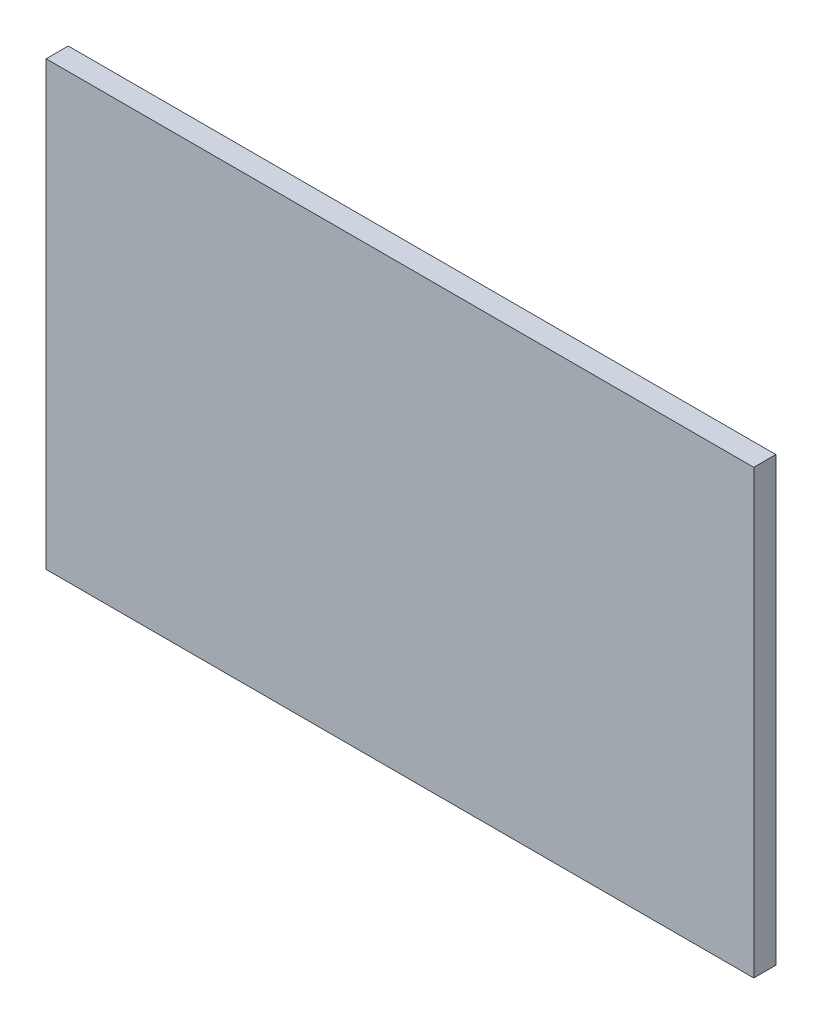
ISO-10303-21;
HEADER;
FILE_DESCRIPTION(('STEP AP214'),'2;1');
FILE_NAME('part.step','',(''),(''),'','','');
FILE_SCHEMA(('AUTOMOTIVE_DESIGN { 1 0 10303 214 1 1 1 1 }'));
ENDSEC;
DATA;
#1=APPLICATION_CONTEXT('core data for automotive mechanical design processes');
#2=APPLICATION_PROTOCOL_DEFINITION('international standard','automotive_design',2000,#1);
#3=PRODUCT_CONTEXT('',#1,'mechanical');
#4=PRODUCT('Part','Part','',(#3));
#5=PRODUCT_RELATED_PRODUCT_CATEGORY('part','',(#4));
#6=PRODUCT_DEFINITION_FORMATION('','',#4);
#7=PRODUCT_DEFINITION_CONTEXT('part definition',#1,'design');
#8=PRODUCT_DEFINITION('design','',#6,#7);
#9=PRODUCT_DEFINITION_SHAPE('','',#8);
#10=(LENGTH_UNIT() NAMED_UNIT(*) SI_UNIT(.MILLI.,.METRE.));
#11=(NAMED_UNIT(*) PLANE_ANGLE_UNIT() SI_UNIT($,.RADIAN.));
#12=(NAMED_UNIT(*) SI_UNIT($,.STERADIAN.) SOLID_ANGLE_UNIT());
#13=UNCERTAINTY_MEASURE_WITH_UNIT(LENGTH_MEASURE(1.E-05),#10,'distance_accuracy_value','');
#14=(GEOMETRIC_REPRESENTATION_CONTEXT(3) GLOBAL_UNCERTAINTY_ASSIGNED_CONTEXT((#13)) GLOBAL_UNIT_ASSIGNED_CONTEXT((#10,
#11,#12)) REPRESENTATION_CONTEXT('',''));
#15=CARTESIAN_POINT('',(0.,0.,0.));
#16=DIRECTION('',(0.,0.,1.));
#17=DIRECTION('',(1.,0.,0.));
#18=AXIS2_PLACEMENT_3D('',#15,#16,#17);
#19=CARTESIAN_POINT('',(400.,250.,25.));
#20=DIRECTION('',(-1.,0.,0.));
#21=DIRECTION('',(0.,-1.,0.));
#22=AXIS2_PLACEMENT_3D('',#19,#20,#21);
#23=PLANE('',#22);
#24=DIRECTION('',(0.,1.,0.));
#25=VECTOR('',#24,1.);
#26=CARTESIAN_POINT('',(400.,250.,0.));
#27=LINE('',#26,#25);
#28=CARTESIAN_POINT('',(400.,-250.,0.));
#29=VERTEX_POINT('',#28);
#30=CARTESIAN_POINT('',(400.,250.,0.));
#31=VERTEX_POINT('',#30);
#32=EDGE_CURVE('E98',#29,#31,#27,.T.);
#33=ORIENTED_EDGE('',*,*,#32,.T.);
#34=DIRECTION('',(0.,0.,-1.));
#35=VECTOR('',#34,1.);
#36=CARTESIAN_POINT('',(400.,250.,25.));
#37=LINE('',#36,#35);
#38=CARTESIAN_POINT('',(400.,250.,25.));
#39=VERTEX_POINT('',#38);
#40=EDGE_CURVE('E11',#39,#31,#37,.T.);
#41=ORIENTED_EDGE('',*,*,#40,.F.);
#42=DIRECTION('',(0.,1.,0.));
#43=VECTOR('',#42,1.);
#44=CARTESIAN_POINT('',(400.,250.,25.));
#45=LINE('',#44,#43);
#46=CARTESIAN_POINT('',(400.,-250.,25.));
#47=VERTEX_POINT('',#46);
#48=EDGE_CURVE('E86',#47,#39,#45,.T.);
#49=ORIENTED_EDGE('',*,*,#48,.F.);
#50=DIRECTION('',(0.,0.,-1.));
#51=VECTOR('',#50,1.);
#52=CARTESIAN_POINT('',(400.,-250.,25.));
#53=LINE('',#52,#51);
#54=EDGE_CURVE('E94',#47,#29,#53,.T.);
#55=ORIENTED_EDGE('',*,*,#54,.T.);
#56=EDGE_LOOP('',(#33,#41,#49,#55));
#57=FACE_BOUND('',#56,.T.);
#58=ADVANCED_FACE('F35',(#57),#23,.F.);
#59=CARTESIAN_POINT('',(-400.,250.,25.));
#60=DIRECTION('',(0.,-1.,0.));
#61=DIRECTION('',(0.,0.,-1.));
#62=AXIS2_PLACEMENT_3D('',#59,#60,#61);
#63=PLANE('',#62);
#64=DIRECTION('',(-1.,0.,0.));
#65=VECTOR('',#64,1.);
#66=CARTESIAN_POINT('',(-400.,250.,0.));
#67=LINE('',#66,#65);
#68=CARTESIAN_POINT('',(-400.,250.,0.));
#69=VERTEX_POINT('',#68);
#70=EDGE_CURVE('E90',#31,#69,#67,.T.);
#71=ORIENTED_EDGE('',*,*,#70,.T.);
#72=DIRECTION('',(0.,0.,-1.));
#73=VECTOR('',#72,1.);
#74=CARTESIAN_POINT('',(-400.,250.,25.));
#75=LINE('',#74,#73);
#76=CARTESIAN_POINT('',(-400.,250.,25.));
#77=VERTEX_POINT('',#76);
#78=EDGE_CURVE('E43',#77,#69,#75,.T.);
#79=ORIENTED_EDGE('',*,*,#78,.F.);
#80=DIRECTION('',(-1.,0.,0.));
#81=VECTOR('',#80,1.);
#82=CARTESIAN_POINT('',(-400.,250.,25.));
#83=LINE('',#82,#81);
#84=EDGE_CURVE('E81',#39,#77,#83,.T.);
#85=ORIENTED_EDGE('',*,*,#84,.F.);
#86=ORIENTED_EDGE('',*,*,#40,.T.);
#87=EDGE_LOOP('',(#71,#79,#85,#86));
#88=FACE_BOUND('',#87,.T.);
#89=ADVANCED_FACE('F89',(#88),#63,.F.);
#90=CARTESIAN_POINT('',(-400.,250.,25.));
#91=DIRECTION('',(1.,0.,0.));
#92=DIRECTION('',(0.,1.,0.));
#93=AXIS2_PLACEMENT_3D('',#90,#91,#92);
#94=PLANE('',#93);
#95=DIRECTION('',(0.,-1.,0.));
#96=VECTOR('',#95,1.);
#97=CARTESIAN_POINT('',(-400.,250.,0.));
#98=LINE('',#97,#96);
#99=CARTESIAN_POINT('',(-400.,-250.,0.));
#100=VERTEX_POINT('',#99);
#101=EDGE_CURVE('E68',#69,#100,#98,.T.);
#102=ORIENTED_EDGE('',*,*,#101,.T.);
#103=DIRECTION('',(0.,0.,-1.));
#104=VECTOR('',#103,1.);
#105=CARTESIAN_POINT('',(-400.,-250.,25.));
#106=LINE('',#105,#104);
#107=CARTESIAN_POINT('',(-400.,-250.,25.));
#108=VERTEX_POINT('',#107);
#109=EDGE_CURVE('E91',#108,#100,#106,.T.);
#110=ORIENTED_EDGE('',*,*,#109,.F.);
#111=DIRECTION('',(0.,-1.,0.));
#112=VECTOR('',#111,1.);
#113=CARTESIAN_POINT('',(-400.,250.,25.));
#114=LINE('',#113,#112);
#115=EDGE_CURVE('E84',#77,#108,#114,.T.);
#116=ORIENTED_EDGE('',*,*,#115,.F.);
#117=ORIENTED_EDGE('',*,*,#78,.T.);
#118=EDGE_LOOP('',(#102,#110,#116,#117));
#119=FACE_BOUND('',#118,.T.);
#120=ADVANCED_FACE('F92',(#119),#94,.F.);
#121=CARTESIAN_POINT('',(-400.,-250.,25.));
#122=DIRECTION('',(0.,1.,0.));
#123=DIRECTION('',(0.,0.,1.));
#124=AXIS2_PLACEMENT_3D('',#121,#122,#123);
#125=PLANE('',#124);
#126=DIRECTION('',(1.,0.,0.));
#127=VECTOR('',#126,1.);
#128=CARTESIAN_POINT('',(-400.,-250.,0.));
#129=LINE('',#128,#127);
#130=EDGE_CURVE('E74',#100,#29,#129,.T.);
#131=ORIENTED_EDGE('',*,*,#130,.T.);
#132=ORIENTED_EDGE('',*,*,#54,.F.);
#133=DIRECTION('',(1.,0.,0.));
#134=VECTOR('',#133,1.);
#135=CARTESIAN_POINT('',(-400.,-250.,25.));
#136=LINE('',#135,#134);
#137=EDGE_CURVE('E51',#108,#47,#136,.T.);
#138=ORIENTED_EDGE('',*,*,#137,.F.);
#139=ORIENTED_EDGE('',*,*,#109,.T.);
#140=EDGE_LOOP('',(#131,#132,#138,#139));
#141=FACE_BOUND('',#140,.T.);
#142=ADVANCED_FACE('F105',(#141),#125,.F.);
#143=CARTESIAN_POINT('',(0.,0.,25.));
#144=DIRECTION('',(0.,0.,1.));
#145=DIRECTION('',(1.,0.,0.));
#146=AXIS2_PLACEMENT_3D('',#143,#144,#145);
#147=PLANE('',#146);
#148=ORIENTED_EDGE('',*,*,#48,.T.);
#149=ORIENTED_EDGE('',*,*,#84,.T.);
#150=ORIENTED_EDGE('',*,*,#115,.T.);
#151=ORIENTED_EDGE('',*,*,#137,.T.);
#152=EDGE_LOOP('',(#148,#149,#150,#151));
#153=FACE_BOUND('',#152,.T.);
#154=ADVANCED_FACE('F82',(#153),#147,.T.);
#155=CARTESIAN_POINT('',(0.,0.,0.));
#156=DIRECTION('',(0.,0.,1.));
#157=DIRECTION('',(1.,0.,0.));
#158=AXIS2_PLACEMENT_3D('',#155,#156,#157);
#159=PLANE('',#158);
#160=ORIENTED_EDGE('',*,*,#32,.F.);
#161=ORIENTED_EDGE('',*,*,#130,.F.);
#162=ORIENTED_EDGE('',*,*,#101,.F.);
#163=ORIENTED_EDGE('',*,*,#70,.F.);
#164=EDGE_LOOP('',(#160,#161,#162,#163));
#165=FACE_BOUND('',#164,.T.);
#166=ADVANCED_FACE('F108',(#165),#159,.F.);
#167=CLOSED_SHELL('',(#58,#89,#120,#142,#154,#166));
#168=MANIFOLD_SOLID_BREP('B2',#167);
#169=ADVANCED_BREP_SHAPE_REPRESENTATION('',(#18,#168),#14);
#170=SHAPE_DEFINITION_REPRESENTATION(#9,#169);
ENDSEC;
END-ISO-10303-21;
